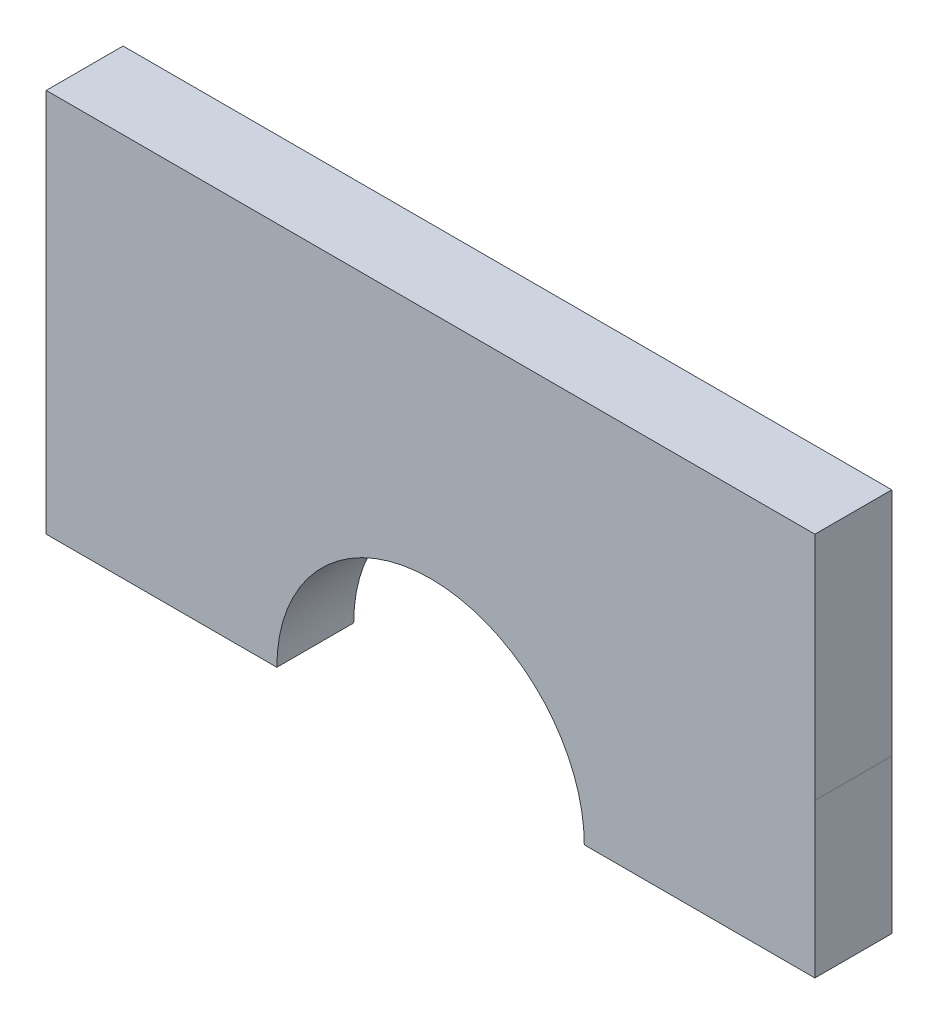
ISO-10303-21;
HEADER;
FILE_DESCRIPTION(('STEP AP214'),'2;1');
FILE_NAME('part.step','',(''),(''),'','','');
FILE_SCHEMA(('AUTOMOTIVE_DESIGN { 1 0 10303 214 1 1 1 1 }'));
ENDSEC;
DATA;
#1=APPLICATION_CONTEXT('core data for automotive mechanical design processes');
#2=APPLICATION_PROTOCOL_DEFINITION('international standard','automotive_design',2000,#1);
#3=PRODUCT_CONTEXT('',#1,'mechanical');
#4=PRODUCT('Part','Part','',(#3));
#5=PRODUCT_RELATED_PRODUCT_CATEGORY('part','',(#4));
#6=PRODUCT_DEFINITION_FORMATION('','',#4);
#7=PRODUCT_DEFINITION_CONTEXT('part definition',#1,'design');
#8=PRODUCT_DEFINITION('design','',#6,#7);
#9=PRODUCT_DEFINITION_SHAPE('','',#8);
#10=(LENGTH_UNIT() NAMED_UNIT(*) SI_UNIT(.MILLI.,.METRE.));
#11=(NAMED_UNIT(*) PLANE_ANGLE_UNIT() SI_UNIT($,.RADIAN.));
#12=(NAMED_UNIT(*) SI_UNIT($,.STERADIAN.) SOLID_ANGLE_UNIT());
#13=UNCERTAINTY_MEASURE_WITH_UNIT(LENGTH_MEASURE(1.E-05),#10,'distance_accuracy_value','');
#14=(GEOMETRIC_REPRESENTATION_CONTEXT(3) GLOBAL_UNCERTAINTY_ASSIGNED_CONTEXT((#13)) GLOBAL_UNIT_ASSIGNED_CONTEXT((#10,
#11,#12)) REPRESENTATION_CONTEXT('',''));
#15=CARTESIAN_POINT('',(0.,0.,0.));
#16=DIRECTION('',(0.,0.,1.));
#17=DIRECTION('',(1.,0.,0.));
#18=AXIS2_PLACEMENT_3D('',#15,#16,#17);
#19=CARTESIAN_POINT('',(100.,0.,10.));
#20=DIRECTION('',(-1.,0.,0.));
#21=DIRECTION('',(0.,0.,1.));
#22=AXIS2_PLACEMENT_3D('',#19,#20,#21);
#23=PLANE('',#22);
#24=DIRECTION('',(0.,0.,-1.));
#25=VECTOR('',#24,1.);
#26=CARTESIAN_POINT('',(100.,20.,10.));
#27=LINE('',#26,#25);
#28=CARTESIAN_POINT('',(100.,20.,10.));
#29=VERTEX_POINT('',#28);
#30=CARTESIAN_POINT('',(100.,20.,0.));
#31=VERTEX_POINT('',#30);
#32=EDGE_CURVE('E11',#29,#31,#27,.T.);
#33=ORIENTED_EDGE('',*,*,#32,.F.);
#34=DIRECTION('',(0.,1.,0.));
#35=VECTOR('',#34,1.);
#36=CARTESIAN_POINT('',(100.,0.,10.));
#37=LINE('',#36,#35);
#38=CARTESIAN_POINT('',(100.,0.,10.));
#39=VERTEX_POINT('',#38);
#40=EDGE_CURVE('E174',#39,#29,#37,.T.);
#41=ORIENTED_EDGE('',*,*,#40,.F.);
#42=DIRECTION('',(0.,0.,-1.));
#43=VECTOR('',#42,1.);
#44=CARTESIAN_POINT('',(100.,0.,10.));
#45=LINE('',#44,#43);
#46=CARTESIAN_POINT('',(100.,0.,0.));
#47=VERTEX_POINT('',#46);
#48=EDGE_CURVE('E145',#39,#47,#45,.T.);
#49=ORIENTED_EDGE('',*,*,#48,.T.);
#50=DIRECTION('',(0.,1.,0.));
#51=VECTOR('',#50,1.);
#52=CARTESIAN_POINT('',(100.,0.,0.));
#53=LINE('',#52,#51);
#54=EDGE_CURVE('E124',#47,#31,#53,.T.);
#55=ORIENTED_EDGE('',*,*,#54,.T.);
#56=EDGE_LOOP('',(#33,#41,#49,#55));
#57=FACE_BOUND('',#56,.T.);
#58=ADVANCED_FACE('F39',(#57),#23,.F.);
#59=CARTESIAN_POINT('',(0.,0.,10.));
#60=DIRECTION('',(1.,0.,0.));
#61=DIRECTION('',(0.,0.,-1.));
#62=AXIS2_PLACEMENT_3D('',#59,#60,#61);
#63=PLANE('',#62);
#64=DIRECTION('',(0.,0.,1.));
#65=VECTOR('',#64,1.);
#66=CARTESIAN_POINT('',(0.,20.,10.));
#67=LINE('',#66,#65);
#68=CARTESIAN_POINT('',(0.,20.,0.));
#69=VERTEX_POINT('',#68);
#70=CARTESIAN_POINT('',(0.,20.,10.));
#71=VERTEX_POINT('',#70);
#72=EDGE_CURVE('E48',#69,#71,#67,.T.);
#73=ORIENTED_EDGE('',*,*,#72,.F.);
#74=DIRECTION('',(0.,-1.,0.));
#75=VECTOR('',#74,1.);
#76=CARTESIAN_POINT('',(0.,0.,0.));
#77=LINE('',#76,#75);
#78=CARTESIAN_POINT('',(0.,0.,0.));
#79=VERTEX_POINT('',#78);
#80=EDGE_CURVE('E130',#69,#79,#77,.T.);
#81=ORIENTED_EDGE('',*,*,#80,.T.);
#82=DIRECTION('',(0.,0.,-1.));
#83=VECTOR('',#82,1.);
#84=CARTESIAN_POINT('',(0.,0.,10.));
#85=LINE('',#84,#83);
#86=CARTESIAN_POINT('',(0.,0.,10.));
#87=VERTEX_POINT('',#86);
#88=EDGE_CURVE('E147',#87,#79,#85,.T.);
#89=ORIENTED_EDGE('',*,*,#88,.F.);
#90=DIRECTION('',(0.,-1.,0.));
#91=VECTOR('',#90,1.);
#92=CARTESIAN_POINT('',(0.,0.,10.));
#93=LINE('',#92,#91);
#94=EDGE_CURVE('E137',#71,#87,#93,.T.);
#95=ORIENTED_EDGE('',*,*,#94,.F.);
#96=EDGE_LOOP('',(#73,#81,#89,#95));
#97=FACE_BOUND('',#96,.T.);
#98=ADVANCED_FACE('F161',(#97),#63,.F.);
#99=CARTESIAN_POINT('',(0.,0.,10.));
#100=DIRECTION('',(0.,1.,0.));
#101=DIRECTION('',(0.,0.,1.));
#102=AXIS2_PLACEMENT_3D('',#99,#100,#101);
#103=PLANE('',#102);
#104=DIRECTION('',(1.,0.,0.));
#105=VECTOR('',#104,1.);
#106=CARTESIAN_POINT('',(0.,0.,0.));
#107=LINE('',#106,#105);
#108=CARTESIAN_POINT('',(30.,0.,0.));
#109=VERTEX_POINT('',#108);
#110=EDGE_CURVE('E125',#79,#109,#107,.T.);
#111=ORIENTED_EDGE('',*,*,#110,.T.);
#112=DIRECTION('',(0.,0.,1.));
#113=VECTOR('',#112,1.);
#114=CARTESIAN_POINT('',(30.,0.,0.));
#115=LINE('',#114,#113);
#116=CARTESIAN_POINT('',(30.,0.,10.));
#117=VERTEX_POINT('',#116);
#118=EDGE_CURVE('E107',#109,#117,#115,.T.);
#119=ORIENTED_EDGE('',*,*,#118,.T.);
#120=DIRECTION('',(1.,0.,0.));
#121=VECTOR('',#120,1.);
#122=CARTESIAN_POINT('',(0.,0.,10.));
#123=LINE('',#122,#121);
#124=EDGE_CURVE('E169',#87,#117,#123,.T.);
#125=ORIENTED_EDGE('',*,*,#124,.F.);
#126=ORIENTED_EDGE('',*,*,#88,.T.);
#127=EDGE_LOOP('',(#111,#119,#125,#126));
#128=FACE_BOUND('',#127,.T.);
#129=ADVANCED_FACE('F182',(#128),#103,.F.);
#130=CARTESIAN_POINT('',(0.,50.,0.));
#131=VERTEX_POINT('',#130);
#132=EDGE_CURVE('E126',#131,#69,#77,.T.);
#133=ORIENTED_EDGE('',*,*,#132,.T.);
#134=ORIENTED_EDGE('',*,*,#72,.T.);
#135=CARTESIAN_POINT('',(0.,50.,10.));
#136=VERTEX_POINT('',#135);
#137=EDGE_CURVE('E156',#136,#71,#93,.T.);
#138=ORIENTED_EDGE('',*,*,#137,.F.);
#139=DIRECTION('',(0.,0.,-1.));
#140=VECTOR('',#139,1.);
#141=CARTESIAN_POINT('',(0.,50.,10.));
#142=LINE('',#141,#140);
#143=EDGE_CURVE('E138',#136,#131,#142,.T.);
#144=ORIENTED_EDGE('',*,*,#143,.T.);
#145=EDGE_LOOP('',(#133,#134,#138,#144));
#146=FACE_BOUND('',#145,.T.);
#147=ADVANCED_FACE('F41',(#146),#63,.F.);
#148=CARTESIAN_POINT('',(70.,0.,10.));
#149=VERTEX_POINT('',#148);
#150=EDGE_CURVE('E120',#149,#39,#123,.T.);
#151=ORIENTED_EDGE('',*,*,#150,.F.);
#152=DIRECTION('',(0.,0.,1.));
#153=VECTOR('',#152,1.);
#154=CARTESIAN_POINT('',(70.,0.,0.));
#155=LINE('',#154,#153);
#156=CARTESIAN_POINT('',(70.,0.,0.));
#157=VERTEX_POINT('',#156);
#158=EDGE_CURVE('E104',#149,#157,#155,.F.);
#159=ORIENTED_EDGE('',*,*,#158,.T.);
#160=EDGE_CURVE('E118',#157,#47,#107,.T.);
#161=ORIENTED_EDGE('',*,*,#160,.T.);
#162=ORIENTED_EDGE('',*,*,#48,.F.);
#163=EDGE_LOOP('',(#151,#159,#161,#162));
#164=FACE_BOUND('',#163,.T.);
#165=ADVANCED_FACE('F116',(#164),#103,.F.);
#166=CARTESIAN_POINT('',(100.,50.,10.));
#167=VERTEX_POINT('',#166);
#168=EDGE_CURVE('E173',#29,#167,#37,.T.);
#169=ORIENTED_EDGE('',*,*,#168,.F.);
#170=ORIENTED_EDGE('',*,*,#32,.T.);
#171=CARTESIAN_POINT('',(100.,50.,0.));
#172=VERTEX_POINT('',#171);
#173=EDGE_CURVE('E128',#31,#172,#53,.T.);
#174=ORIENTED_EDGE('',*,*,#173,.T.);
#175=DIRECTION('',(0.,0.,-1.));
#176=VECTOR('',#175,1.);
#177=CARTESIAN_POINT('',(100.,50.,10.));
#178=LINE('',#177,#176);
#179=EDGE_CURVE('E141',#167,#172,#178,.T.);
#180=ORIENTED_EDGE('',*,*,#179,.F.);
#181=EDGE_LOOP('',(#169,#170,#174,#180));
#182=FACE_BOUND('',#181,.T.);
#183=ADVANCED_FACE('F177',(#182),#23,.F.);
#184=CARTESIAN_POINT('',(0.,50.,10.));
#185=DIRECTION('',(0.,-1.,0.));
#186=DIRECTION('',(0.,0.,-1.));
#187=AXIS2_PLACEMENT_3D('',#184,#185,#186);
#188=PLANE('',#187);
#189=DIRECTION('',(-1.,0.,0.));
#190=VECTOR('',#189,1.);
#191=CARTESIAN_POINT('',(0.,50.,0.));
#192=LINE('',#191,#190);
#193=EDGE_CURVE('E135',#172,#131,#192,.T.);
#194=ORIENTED_EDGE('',*,*,#193,.T.);
#195=ORIENTED_EDGE('',*,*,#143,.F.);
#196=DIRECTION('',(-1.,0.,0.));
#197=VECTOR('',#196,1.);
#198=CARTESIAN_POINT('',(0.,50.,10.));
#199=LINE('',#198,#197);
#200=EDGE_CURVE('E142',#167,#136,#199,.T.);
#201=ORIENTED_EDGE('',*,*,#200,.F.);
#202=ORIENTED_EDGE('',*,*,#179,.T.);
#203=EDGE_LOOP('',(#194,#195,#201,#202));
#204=FACE_BOUND('',#203,.T.);
#205=ADVANCED_FACE('F180',(#204),#188,.F.);
#206=CARTESIAN_POINT('',(0.,0.,10.));
#207=DIRECTION('',(0.,0.,-1.));
#208=DIRECTION('',(-1.,0.,0.));
#209=AXIS2_PLACEMENT_3D('',#206,#207,#208);
#210=PLANE('',#209);
#211=ORIENTED_EDGE('',*,*,#124,.T.);
#212=CARTESIAN_POINT('',(50.,0.,10.));
#213=DIRECTION('',(0.,0.,1.));
#214=DIRECTION('',(1.,0.,0.));
#215=AXIS2_PLACEMENT_3D('',#212,#213,#214);
#216=CIRCLE('',#215,20.);
#217=EDGE_CURVE('E112',#149,#117,#216,.T.);
#218=ORIENTED_EDGE('',*,*,#217,.F.);
#219=ORIENTED_EDGE('',*,*,#150,.T.);
#220=ORIENTED_EDGE('',*,*,#40,.T.);
#221=ORIENTED_EDGE('',*,*,#168,.T.);
#222=ORIENTED_EDGE('',*,*,#200,.T.);
#223=ORIENTED_EDGE('',*,*,#137,.T.);
#224=ORIENTED_EDGE('',*,*,#94,.T.);
#225=EDGE_LOOP('',(#211,#218,#219,#220,#221,#222,#223,#224));
#226=FACE_BOUND('',#225,.T.);
#227=ADVANCED_FACE('F166',(#226),#210,.F.);
#228=CARTESIAN_POINT('',(0.,0.,0.));
#229=DIRECTION('',(0.,0.,-1.));
#230=DIRECTION('',(-1.,0.,0.));
#231=AXIS2_PLACEMENT_3D('',#228,#229,#230);
#232=PLANE('',#231);
#233=CARTESIAN_POINT('',(50.,0.,0.));
#234=DIRECTION('',(0.,0.,1.));
#235=DIRECTION('',(1.,0.,0.));
#236=AXIS2_PLACEMENT_3D('',#233,#234,#235);
#237=CIRCLE('',#236,20.);
#238=EDGE_CURVE('E101',#157,#109,#237,.T.);
#239=ORIENTED_EDGE('',*,*,#238,.T.);
#240=ORIENTED_EDGE('',*,*,#110,.F.);
#241=ORIENTED_EDGE('',*,*,#80,.F.);
#242=ORIENTED_EDGE('',*,*,#132,.F.);
#243=ORIENTED_EDGE('',*,*,#193,.F.);
#244=ORIENTED_EDGE('',*,*,#173,.F.);
#245=ORIENTED_EDGE('',*,*,#54,.F.);
#246=ORIENTED_EDGE('',*,*,#160,.F.);
#247=EDGE_LOOP('',(#239,#240,#241,#242,#243,#244,#245,#246));
#248=FACE_BOUND('',#247,.T.);
#249=ADVANCED_FACE('F123',(#248),#232,.T.);
#250=CARTESIAN_POINT('',(50.,0.,0.));
#251=DIRECTION('',(0.,0.,1.));
#252=DIRECTION('',(1.,0.,0.));
#253=AXIS2_PLACEMENT_3D('',#250,#251,#252);
#254=CYLINDRICAL_SURFACE('',#253,20.);
#255=ORIENTED_EDGE('',*,*,#238,.F.);
#256=ORIENTED_EDGE('',*,*,#158,.F.);
#257=ORIENTED_EDGE('',*,*,#217,.T.);
#258=ORIENTED_EDGE('',*,*,#118,.F.);
#259=EDGE_LOOP('',(#255,#256,#257,#258));
#260=FACE_BOUND('',#259,.T.);
#261=ADVANCED_FACE('F103',(#260),#254,.F.);
#262=CLOSED_SHELL('',(#58,#98,#129,#147,#165,#183,#205,#227,#249,#261));
#263=MANIFOLD_SOLID_BREP('B2',#262);
#264=ADVANCED_BREP_SHAPE_REPRESENTATION('',(#18,#263),#14);
#265=SHAPE_DEFINITION_REPRESENTATION(#9,#264);
ENDSEC;
END-ISO-10303-21;
